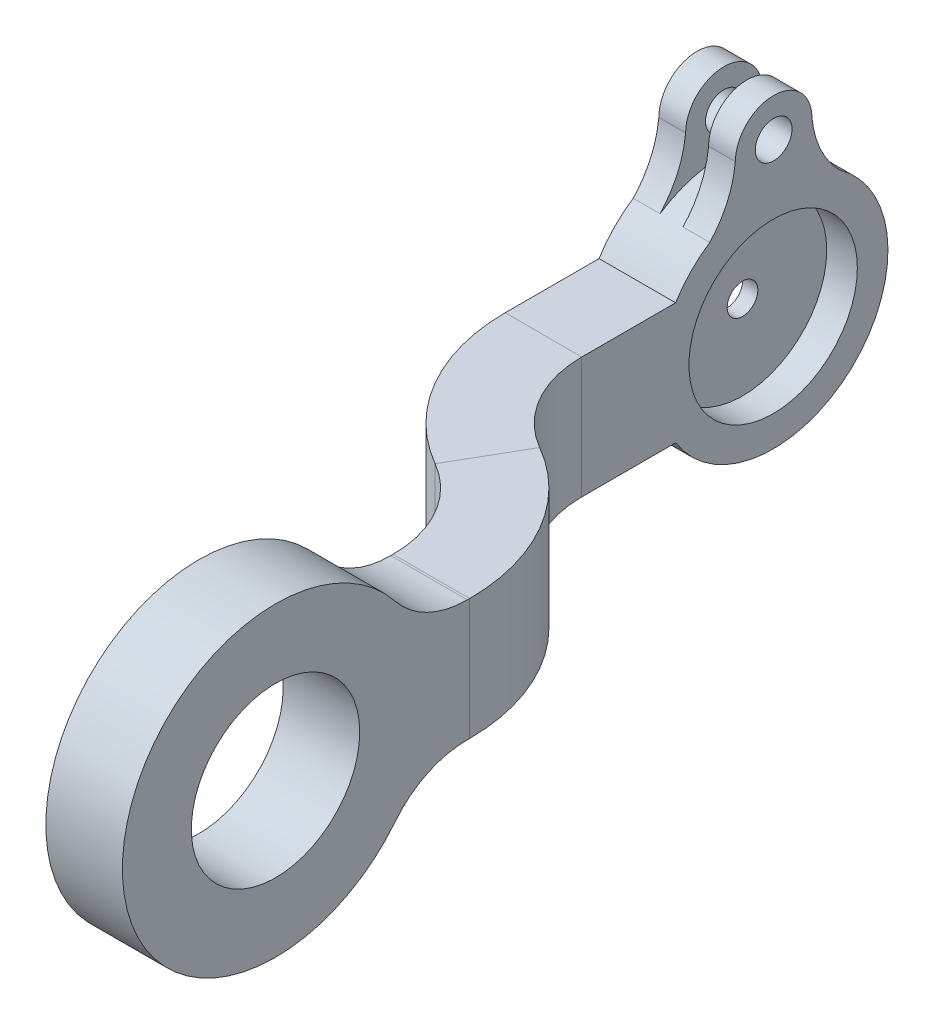
ISO-10303-21;
HEADER;
FILE_DESCRIPTION(('STEP AP214'),'2;1');
FILE_NAME('part.step','',(''),(''),'','','');
FILE_SCHEMA(('AUTOMOTIVE_DESIGN { 1 0 10303 214 1 1 1 1 }'));
ENDSEC;
DATA;
#1=APPLICATION_CONTEXT('core data for automotive mechanical design processes');
#2=APPLICATION_PROTOCOL_DEFINITION('international standard','automotive_design',2000,#1);
#3=PRODUCT_CONTEXT('',#1,'mechanical');
#4=PRODUCT('Part','Part','',(#3));
#5=PRODUCT_RELATED_PRODUCT_CATEGORY('part','',(#4));
#6=PRODUCT_DEFINITION_FORMATION('','',#4);
#7=PRODUCT_DEFINITION_CONTEXT('part definition',#1,'design');
#8=PRODUCT_DEFINITION('design','',#6,#7);
#9=PRODUCT_DEFINITION_SHAPE('','',#8);
#10=(LENGTH_UNIT() NAMED_UNIT(*) SI_UNIT(.MILLI.,.METRE.));
#11=(NAMED_UNIT(*) PLANE_ANGLE_UNIT() SI_UNIT($,.RADIAN.));
#12=(NAMED_UNIT(*) SI_UNIT($,.STERADIAN.) SOLID_ANGLE_UNIT());
#13=UNCERTAINTY_MEASURE_WITH_UNIT(LENGTH_MEASURE(1.E-05),#10,'distance_accuracy_value','');
#14=(GEOMETRIC_REPRESENTATION_CONTEXT(3) GLOBAL_UNCERTAINTY_ASSIGNED_CONTEXT((#13)) GLOBAL_UNIT_ASSIGNED_CONTEXT((#10,
#11,#12)) REPRESENTATION_CONTEXT('',''));
#15=CARTESIAN_POINT('',(0.,0.,0.));
#16=DIRECTION('',(0.,0.,1.));
#17=DIRECTION('',(1.,0.,0.));
#18=AXIS2_PLACEMENT_3D('',#15,#16,#17);
#19=CARTESIAN_POINT('',(-21.,0.,-85.));
#20=DIRECTION('',(1.,0.,0.));
#21=DIRECTION('',(0.,0.,-1.));
#22=AXIS2_PLACEMENT_3D('',#19,#20,#21);
#23=CYLINDRICAL_SURFACE('',#22,2.);
#24=CARTESIAN_POINT('',(-21.,0.,-85.));
#25=DIRECTION('',(1.,0.,0.));
#26=DIRECTION('',(0.,0.,-1.));
#27=AXIS2_PLACEMENT_3D('',#24,#25,#26);
#28=CIRCLE('',#27,2.);
#29=CARTESIAN_POINT('',(-21.,0.,-87.));
#30=VERTEX_POINT('',#29);
#31=EDGE_CURVE('E526',#30,#30,#28,.T.);
#32=ORIENTED_EDGE('',*,*,#31,.F.);
#33=EDGE_LOOP('',(#32));
#34=FACE_BOUND('',#33,.T.);
#35=CARTESIAN_POINT('',(-19.,0.,-85.));
#36=DIRECTION('',(1.,0.,0.));
#37=DIRECTION('',(0.,0.,-1.));
#38=AXIS2_PLACEMENT_3D('',#35,#36,#37);
#39=CIRCLE('',#38,2.);
#40=CARTESIAN_POINT('',(-19.,0.,-87.));
#41=VERTEX_POINT('',#40);
#42=EDGE_CURVE('E45',#41,#41,#39,.F.);
#43=ORIENTED_EDGE('',*,*,#42,.F.);
#44=EDGE_LOOP('',(#43));
#45=FACE_BOUND('',#44,.T.);
#46=ADVANCED_FACE('F41',(#34,#45),#23,.F.);
#47=CARTESIAN_POINT('',(-5.,-19.9174516240623,-25.0458603526239));
#48=DIRECTION('',(1.,0.,0.));
#49=DIRECTION('',(0.,0.,-1.));
#50=AXIS2_PLACEMENT_3D('',#47,#48,#49);
#51=CYLINDRICAL_SURFACE('',#50,12.);
#52=DIRECTION('',(-1.,0.,0.));
#53=VECTOR('',#52,1.);
#54=CARTESIAN_POINT('',(-5.,-7.91745162406235,-25.0458603526239));
#55=LINE('',#54,#53);
#56=CARTESIAN_POINT('',(5.,-7.91745162406235,-25.0458603526239));
#57=VERTEX_POINT('',#56);
#58=CARTESIAN_POINT('',(-5.,-7.91745162406235,-25.0458603526239));
#59=VERTEX_POINT('',#58);
#60=EDGE_CURVE('E457',#57,#59,#55,.T.);
#61=ORIENTED_EDGE('',*,*,#60,.F.);
#62=CARTESIAN_POINT('',(5.,-19.9174516240623,-25.0458603526239));
#63=DIRECTION('',(1.,0.,0.));
#64=DIRECTION('',(0.,0.,-1.));
#65=AXIS2_PLACEMENT_3D('',#62,#63,#64);
#66=CIRCLE('',#65,12.);
#67=CARTESIAN_POINT('',(5.,-12.448407265039,-15.6536627203899));
#68=VERTEX_POINT('',#67);
#69=EDGE_CURVE('E51',#57,#68,#66,.T.);
#70=ORIENTED_EDGE('',*,*,#69,.T.);
#71=DIRECTION('',(1.,0.,0.));
#72=VECTOR('',#71,1.);
#73=CARTESIAN_POINT('',(-5.,-12.448407265039,-15.6536627203899));
#74=LINE('',#73,#72);
#75=CARTESIAN_POINT('',(-5.,-12.448407265039,-15.6536627203899));
#76=VERTEX_POINT('',#75);
#77=EDGE_CURVE('E461',#76,#68,#74,.T.);
#78=ORIENTED_EDGE('',*,*,#77,.F.);
#79=CARTESIAN_POINT('',(-5.,-19.9174516240623,-25.0458603526239));
#80=DIRECTION('',(-1.,0.,0.));
#81=DIRECTION('',(0.,0.,1.));
#82=AXIS2_PLACEMENT_3D('',#79,#80,#81);
#83=CIRCLE('',#82,12.);
#84=EDGE_CURVE('E11',#76,#59,#83,.T.);
#85=ORIENTED_EDGE('',*,*,#84,.T.);
#86=EDGE_LOOP('',(#61,#70,#78,#85));
#87=FACE_BOUND('',#86,.T.);
#88=ADVANCED_FACE('F43',(#87),#51,.F.);
#89=CARTESIAN_POINT('',(-5.,19.9174516240623,-25.0458603526239));
#90=DIRECTION('',(1.,0.,0.));
#91=DIRECTION('',(0.,0.,-1.));
#92=AXIS2_PLACEMENT_3D('',#89,#90,#91);
#93=CYLINDRICAL_SURFACE('',#92,12.);
#94=DIRECTION('',(-1.,0.,0.));
#95=VECTOR('',#94,1.);
#96=CARTESIAN_POINT('',(-5.,7.91745162406235,-25.0458603526239));
#97=LINE('',#96,#95);
#98=CARTESIAN_POINT('',(-5.,7.91745162406235,-25.0458603526239));
#99=VERTEX_POINT('',#98);
#100=CARTESIAN_POINT('',(5.,7.91745162406235,-25.0458603526239));
#101=VERTEX_POINT('',#100);
#102=EDGE_CURVE('E438',#99,#101,#97,.F.);
#103=ORIENTED_EDGE('',*,*,#102,.F.);
#104=CARTESIAN_POINT('',(-5.,19.9174516240623,-25.0458603526239));
#105=DIRECTION('',(-1.,0.,0.));
#106=DIRECTION('',(0.,0.,1.));
#107=AXIS2_PLACEMENT_3D('',#104,#105,#106);
#108=CIRCLE('',#107,12.);
#109=CARTESIAN_POINT('',(-5.,12.448407265039,-15.6536627203899));
#110=VERTEX_POINT('',#109);
#111=EDGE_CURVE('E451',#99,#110,#108,.T.);
#112=ORIENTED_EDGE('',*,*,#111,.T.);
#113=DIRECTION('',(1.,0.,0.));
#114=VECTOR('',#113,1.);
#115=CARTESIAN_POINT('',(-5.,12.448407265039,-15.6536627203899));
#116=LINE('',#115,#114);
#117=CARTESIAN_POINT('',(5.,12.448407265039,-15.6536627203899));
#118=VERTEX_POINT('',#117);
#119=EDGE_CURVE('E447',#118,#110,#116,.F.);
#120=ORIENTED_EDGE('',*,*,#119,.F.);
#121=CARTESIAN_POINT('',(5.,19.9174516240623,-25.0458603526239));
#122=DIRECTION('',(1.,0.,0.));
#123=DIRECTION('',(0.,0.,-1.));
#124=AXIS2_PLACEMENT_3D('',#121,#122,#123);
#125=CIRCLE('',#124,12.);
#126=EDGE_CURVE('E454',#118,#101,#125,.T.);
#127=ORIENTED_EDGE('',*,*,#126,.T.);
#128=EDGE_LOOP('',(#103,#112,#120,#127));
#129=FACE_BOUND('',#128,.T.);
#130=ADVANCED_FACE('F636',(#129),#93,.F.);
#131=CARTESIAN_POINT('',(-25.,0.,-85.));
#132=DIRECTION('',(1.,0.,0.));
#133=DIRECTION('',(0.,0.,-1.));
#134=AXIS2_PLACEMENT_3D('',#131,#132,#133);
#135=CYLINDRICAL_SURFACE('',#134,15.);
#136=CARTESIAN_POINT('',(-21.5,0.,-85.));
#137=DIRECTION('',(-1.,0.,0.));
#138=DIRECTION('',(0.,0.,1.));
#139=AXIS2_PLACEMENT_3D('',#136,#137,#138);
#140=CIRCLE('',#139,15.);
#141=CARTESIAN_POINT('',(-21.5,12.2408850503567,-93.6695290058892));
#142=VERTEX_POINT('',#141);
#143=CARTESIAN_POINT('',(-21.5,12.510308438301,-76.7239995904679));
#144=VERTEX_POINT('',#143);
#145=EDGE_CURVE('E430',#142,#144,#140,.F.);
#146=ORIENTED_EDGE('',*,*,#145,.T.);
#147=DIRECTION('',(-1.,0.,0.));
#148=VECTOR('',#147,1.);
#149=CARTESIAN_POINT('',(-21.5,12.510308438301,-76.7239995904679));
#150=LINE('',#149,#148);
#151=CARTESIAN_POINT('',(-25.,12.510308438301,-76.7239995904679));
#152=VERTEX_POINT('',#151);
#153=EDGE_CURVE('E205',#144,#152,#150,.T.);
#154=ORIENTED_EDGE('',*,*,#153,.T.);
#155=CARTESIAN_POINT('',(-25.,0.,-85.));
#156=DIRECTION('',(1.,0.,0.));
#157=DIRECTION('',(0.,0.,-1.));
#158=AXIS2_PLACEMENT_3D('',#155,#156,#157);
#159=CIRCLE('',#158,15.);
#160=CARTESIAN_POINT('',(-25.,7.91745162406235,-72.2597504035191));
#161=VERTEX_POINT('',#160);
#162=EDGE_CURVE('E300',#152,#161,#159,.T.);
#163=ORIENTED_EDGE('',*,*,#162,.T.);
#164=DIRECTION('',(1.,0.,0.));
#165=VECTOR('',#164,1.);
#166=CARTESIAN_POINT('',(-25.,7.91745162406235,-72.2597504035191));
#167=LINE('',#166,#165);
#168=CARTESIAN_POINT('',(-15.,7.91745162406235,-72.2597504035191));
#169=VERTEX_POINT('',#168);
#170=EDGE_CURVE('E299',#161,#169,#167,.T.);
#171=ORIENTED_EDGE('',*,*,#170,.T.);
#172=CARTESIAN_POINT('',(-15.,0.,-85.));
#173=DIRECTION('',(1.,0.,0.));
#174=DIRECTION('',(0.,0.,-1.));
#175=AXIS2_PLACEMENT_3D('',#172,#173,#174);
#176=CIRCLE('',#175,15.);
#177=CARTESIAN_POINT('',(-15.,12.510308438301,-76.7239995904679));
#178=VERTEX_POINT('',#177);
#179=EDGE_CURVE('E292',#178,#169,#176,.T.);
#180=ORIENTED_EDGE('',*,*,#179,.F.);
#181=DIRECTION('',(1.,0.,0.));
#182=VECTOR('',#181,1.);
#183=CARTESIAN_POINT('',(-18.5,12.510308438301,-76.7239995904679));
#184=LINE('',#183,#182);
#185=CARTESIAN_POINT('',(-18.5,12.510308438301,-76.7239995904679));
#186=VERTEX_POINT('',#185);
#187=EDGE_CURVE('E426',#186,#178,#184,.T.);
#188=ORIENTED_EDGE('',*,*,#187,.F.);
#189=CARTESIAN_POINT('',(-18.5,0.,-85.));
#190=DIRECTION('',(1.,0.,0.));
#191=DIRECTION('',(0.,0.,-1.));
#192=AXIS2_PLACEMENT_3D('',#189,#190,#191);
#193=CIRCLE('',#192,15.);
#194=CARTESIAN_POINT('',(-18.5,12.2408850503567,-93.6695290058892));
#195=VERTEX_POINT('',#194);
#196=EDGE_CURVE('E419',#186,#195,#193,.F.);
#197=ORIENTED_EDGE('',*,*,#196,.T.);
#198=DIRECTION('',(1.,0.,0.));
#199=VECTOR('',#198,1.);
#200=CARTESIAN_POINT('',(-18.5,12.2408850503567,-93.6695290058892));
#201=LINE('',#200,#199);
#202=CARTESIAN_POINT('',(-15.,12.2408850503567,-93.6695290058892));
#203=VERTEX_POINT('',#202);
#204=EDGE_CURVE('E423',#203,#195,#201,.F.);
#205=ORIENTED_EDGE('',*,*,#204,.F.);
#206=CARTESIAN_POINT('',(-15.,-7.91745162406235,-72.2597504035191));
#207=VERTEX_POINT('',#206);
#208=EDGE_CURVE('E301',#207,#203,#176,.T.);
#209=ORIENTED_EDGE('',*,*,#208,.F.);
#210=DIRECTION('',(1.,0.,0.));
#211=VECTOR('',#210,1.);
#212=CARTESIAN_POINT('',(-25.,-7.91745162406235,-72.2597504035191));
#213=LINE('',#212,#211);
#214=CARTESIAN_POINT('',(-25.,-7.91745162406235,-72.2597504035191));
#215=VERTEX_POINT('',#214);
#216=EDGE_CURVE('E406',#207,#215,#213,.F.);
#217=ORIENTED_EDGE('',*,*,#216,.T.);
#218=CARTESIAN_POINT('',(-25.,12.2408850503567,-93.6695290058892));
#219=VERTEX_POINT('',#218);
#220=EDGE_CURVE('E296',#215,#219,#159,.T.);
#221=ORIENTED_EDGE('',*,*,#220,.T.);
#222=DIRECTION('',(-1.,0.,0.));
#223=VECTOR('',#222,1.);
#224=CARTESIAN_POINT('',(-21.5,12.2408850503567,-93.6695290058892));
#225=LINE('',#224,#223);
#226=EDGE_CURVE('E433',#219,#142,#225,.F.);
#227=ORIENTED_EDGE('',*,*,#226,.T.);
#228=EDGE_LOOP('',(#146,#154,#163,#171,#180,#188,#197,#205,#209,#217,#221,#227));
#229=FACE_BOUND('',#228,.T.);
#230=ADVANCED_FACE('F565',(#229),#135,.T.);
#231=CARTESIAN_POINT('',(-15.,-7.91745162406235,-85.));
#232=DIRECTION('',(1.,0.,0.));
#233=DIRECTION('',(0.,0.,-1.));
#234=AXIS2_PLACEMENT_3D('',#231,#232,#233);
#235=PLANE('',#234);
#236=CARTESIAN_POINT('',(-15.,0.,-85.));
#237=DIRECTION('',(1.,0.,0.));
#238=DIRECTION('',(0.,0.,-1.));
#239=AXIS2_PLACEMENT_3D('',#236,#237,#238);
#240=CIRCLE('',#239,11.);
#241=CARTESIAN_POINT('',(-15.,0.,-96.));
#242=VERTEX_POINT('',#241);
#243=EDGE_CURVE('E532',#242,#242,#240,.T.);
#244=ORIENTED_EDGE('',*,*,#243,.F.);
#245=EDGE_LOOP('',(#244));
#246=FACE_BOUND('',#245,.T.);
#247=CARTESIAN_POINT('',(-15.,19.972615480825,-85.0684964390711));
#248=DIRECTION('',(1.,0.,0.));
#249=DIRECTION('',(0.,0.,-1.));
#250=AXIS2_PLACEMENT_3D('',#247,#248,#249);
#251=CIRCLE('',#250,2.4);
#252=CARTESIAN_POINT('',(-15.,19.972615480825,-87.468496439071));
#253=VERTEX_POINT('',#252);
#254=EDGE_CURVE('E550',#253,#253,#251,.T.);
#255=ORIENTED_EDGE('',*,*,#254,.F.);
#256=EDGE_LOOP('',(#255));
#257=FACE_BOUND('',#256,.T.);
#258=ORIENTED_EDGE('',*,*,#208,.T.);
#259=CARTESIAN_POINT('',(-15.,11.6439228128336,-94.2885274391543));
#260=CARTESIAN_POINT('',(-15.,15.0282523884813,-90.5702618472204));
#261=CARTESIAN_POINT('',(-15.,19.972615480825,-90.0684964390711));
#262=B_SPLINE_CURVE_WITH_KNOTS('',2,(#259,#260,#261),.UNSPECIFIED.,.F.,.F.,(3,3),(0.,1.),.UNSPECIFIED.);
#263=CARTESIAN_POINT('',(-15.,19.972615480825,-90.068496439071));
#264=VERTEX_POINT('',#263);
#265=EDGE_CURVE('E266',#203,#264,#262,.T.);
#266=ORIENTED_EDGE('',*,*,#265,.T.);
#267=CARTESIAN_POINT('',(-15.,19.972615480825,-85.0684964390711));
#268=DIRECTION('',(1.,0.,0.));
#269=DIRECTION('',(0.,0.,-1.));
#270=AXIS2_PLACEMENT_3D('',#267,#268,#269);
#271=CIRCLE('',#270,4.99999999999999);
#272=CARTESIAN_POINT('',(-15.,19.972615480825,-80.0684964390711));
#273=VERTEX_POINT('',#272);
#274=EDGE_CURVE('E274',#264,#273,#271,.T.);
#275=ORIENTED_EDGE('',*,*,#274,.T.);
#276=CARTESIAN_POINT('',(-15.,19.972615480825,-80.068496439071));
#277=CARTESIAN_POINT('',(-15.,15.0282523884813,-79.5667310309217));
#278=CARTESIAN_POINT('',(-15.,11.6439228128336,-75.8484654389878));
#279=B_SPLINE_CURVE_WITH_KNOTS('',2,(#276,#277,#278),.UNSPECIFIED.,.F.,.F.,(3,3),(0.,1.),.UNSPECIFIED.);
#280=EDGE_CURVE('E261',#273,#178,#279,.T.);
#281=ORIENTED_EDGE('',*,*,#280,.T.);
#282=ORIENTED_EDGE('',*,*,#179,.T.);
#283=DIRECTION('',(0.,0.,1.));
#284=VECTOR('',#283,1.);
#285=CARTESIAN_POINT('',(-15.,7.91745162406235,-85.));
#286=LINE('',#285,#284);
#287=CARTESIAN_POINT('',(-15.,7.91745162406235,-60.));
#288=VERTEX_POINT('',#287);
#289=EDGE_CURVE('E313',#169,#288,#286,.T.);
#290=ORIENTED_EDGE('',*,*,#289,.T.);
#291=DIRECTION('',(0.,1.,0.));
#292=VECTOR('',#291,1.);
#293=CARTESIAN_POINT('',(-15.,-7.91745162406235,-60.));
#294=LINE('',#293,#292);
#295=CARTESIAN_POINT('',(-15.,-7.91745162406235,-60.));
#296=VERTEX_POINT('',#295);
#297=EDGE_CURVE('E309',#296,#288,#294,.T.);
#298=ORIENTED_EDGE('',*,*,#297,.F.);
#299=DIRECTION('',(0.,0.,1.));
#300=VECTOR('',#299,1.);
#301=CARTESIAN_POINT('',(-15.,-7.91745162406235,-85.));
#302=LINE('',#301,#300);
#303=EDGE_CURVE('E308',#207,#296,#302,.T.);
#304=ORIENTED_EDGE('',*,*,#303,.F.);
#305=EDGE_LOOP('',(#258,#266,#275,#281,#282,#290,#298,#304));
#306=FACE_BOUND('',#305,.T.);
#307=ADVANCED_FACE('F561',(#246,#257,#306),#235,.T.);
#308=CARTESIAN_POINT('',(-15.,7.91745162406235,-85.));
#309=DIRECTION('',(0.,1.,0.));
#310=DIRECTION('',(0.,0.,1.));
#311=AXIS2_PLACEMENT_3D('',#308,#309,#310);
#312=PLANE('',#311);
#313=ORIENTED_EDGE('',*,*,#170,.F.);
#314=DIRECTION('',(0.,0.,1.));
#315=VECTOR('',#314,1.);
#316=CARTESIAN_POINT('',(-25.,7.91745162406235,-85.));
#317=LINE('',#316,#315);
#318=CARTESIAN_POINT('',(-25.,7.91745162406235,-60.));
#319=VERTEX_POINT('',#318);
#320=EDGE_CURVE('E360',#161,#319,#317,.T.);
#321=ORIENTED_EDGE('',*,*,#320,.T.);
#322=DIRECTION('',(-1.,0.,0.));
#323=VECTOR('',#322,1.);
#324=CARTESIAN_POINT('',(-15.,7.91745162406235,-60.));
#325=LINE('',#324,#323);
#326=EDGE_CURVE('E316',#288,#319,#325,.T.);
#327=ORIENTED_EDGE('',*,*,#326,.F.);
#328=ORIENTED_EDGE('',*,*,#289,.F.);
#329=EDGE_LOOP('',(#313,#321,#327,#328));
#330=FACE_BOUND('',#329,.T.);
#331=ADVANCED_FACE('F564',(#330),#312,.T.);
#332=CARTESIAN_POINT('',(-25.,-7.91745162406235,-85.));
#333=DIRECTION('',(-1.,0.,0.));
#334=DIRECTION('',(0.,0.,1.));
#335=AXIS2_PLACEMENT_3D('',#332,#333,#334);
#336=PLANE('',#335);
#337=CARTESIAN_POINT('',(-25.,0.,-85.));
#338=DIRECTION('',(-1.,0.,0.));
#339=DIRECTION('',(0.,0.,1.));
#340=AXIS2_PLACEMENT_3D('',#337,#338,#339);
#341=CIRCLE('',#340,11.);
#342=CARTESIAN_POINT('',(-25.,0.,-74.));
#343=VERTEX_POINT('',#342);
#344=EDGE_CURVE('E530',#343,#343,#341,.T.);
#345=ORIENTED_EDGE('',*,*,#344,.F.);
#346=EDGE_LOOP('',(#345));
#347=FACE_BOUND('',#346,.T.);
#348=CARTESIAN_POINT('',(-25.,19.972615480825,-85.0684964390711));
#349=DIRECTION('',(1.,0.,0.));
#350=DIRECTION('',(0.,0.,-1.));
#351=AXIS2_PLACEMENT_3D('',#348,#349,#350);
#352=CIRCLE('',#351,2.4);
#353=CARTESIAN_POINT('',(-25.,19.972615480825,-87.468496439071));
#354=VERTEX_POINT('',#353);
#355=EDGE_CURVE('E443',#354,#354,#352,.T.);
#356=ORIENTED_EDGE('',*,*,#355,.T.);
#357=EDGE_LOOP('',(#356));
#358=FACE_BOUND('',#357,.T.);
#359=ORIENTED_EDGE('',*,*,#162,.F.);
#360=CARTESIAN_POINT('',(-25.,19.972615480825,-80.068496439071));
#361=CARTESIAN_POINT('',(-25.,15.0282523884813,-79.5667310309217));
#362=CARTESIAN_POINT('',(-25.,11.6439228128336,-75.8484654389878));
#363=B_SPLINE_CURVE_WITH_KNOTS('',2,(#360,#361,#362),.UNSPECIFIED.,.F.,.F.,(3,3),(0.,1.),.UNSPECIFIED.);
#364=CARTESIAN_POINT('',(-25.,19.972615480825,-80.0684964390711));
#365=VERTEX_POINT('',#364);
#366=EDGE_CURVE('E476',#365,#152,#363,.T.);
#367=ORIENTED_EDGE('',*,*,#366,.F.);
#368=CARTESIAN_POINT('',(-25.,19.972615480825,-85.0684964390711));
#369=DIRECTION('',(1.,0.,0.));
#370=DIRECTION('',(0.,0.,-1.));
#371=AXIS2_PLACEMENT_3D('',#368,#369,#370);
#372=CIRCLE('',#371,4.99999999999999);
#373=CARTESIAN_POINT('',(-25.,19.972615480825,-90.068496439071));
#374=VERTEX_POINT('',#373);
#375=EDGE_CURVE('E195',#374,#365,#372,.T.);
#376=ORIENTED_EDGE('',*,*,#375,.F.);
#377=CARTESIAN_POINT('',(-25.,11.6439228128336,-94.2885274391543));
#378=CARTESIAN_POINT('',(-25.,15.0282523884813,-90.5702618472204));
#379=CARTESIAN_POINT('',(-25.,19.972615480825,-90.0684964390711));
#380=B_SPLINE_CURVE_WITH_KNOTS('',2,(#377,#378,#379),.UNSPECIFIED.,.F.,.F.,(3,3),(0.,1.),.UNSPECIFIED.);
#381=EDGE_CURVE('E207',#219,#374,#380,.T.);
#382=ORIENTED_EDGE('',*,*,#381,.F.);
#383=ORIENTED_EDGE('',*,*,#220,.F.);
#384=DIRECTION('',(0.,0.,1.));
#385=VECTOR('',#384,1.);
#386=CARTESIAN_POINT('',(-25.,-7.91745162406235,-85.));
#387=LINE('',#386,#385);
#388=CARTESIAN_POINT('',(-25.,-7.91745162406235,-60.));
#389=VERTEX_POINT('',#388);
#390=EDGE_CURVE('E387',#215,#389,#387,.T.);
#391=ORIENTED_EDGE('',*,*,#390,.T.);
#392=DIRECTION('',(0.,-1.,0.));
#393=VECTOR('',#392,1.);
#394=CARTESIAN_POINT('',(-25.,-7.91745162406235,-60.));
#395=LINE('',#394,#393);
#396=EDGE_CURVE('E363',#319,#389,#395,.T.);
#397=ORIENTED_EDGE('',*,*,#396,.F.);
#398=ORIENTED_EDGE('',*,*,#320,.F.);
#399=EDGE_LOOP('',(#359,#367,#376,#382,#383,#391,#397,#398));
#400=FACE_BOUND('',#399,.T.);
#401=ADVANCED_FACE('F593',(#347,#358,#400),#336,.T.);
#402=CARTESIAN_POINT('',(-15.,-7.91745162406235,-85.));
#403=DIRECTION('',(0.,-1.,0.));
#404=DIRECTION('',(0.,0.,-1.));
#405=AXIS2_PLACEMENT_3D('',#402,#403,#404);
#406=PLANE('',#405);
#407=ORIENTED_EDGE('',*,*,#216,.F.);
#408=ORIENTED_EDGE('',*,*,#303,.T.);
#409=DIRECTION('',(1.,0.,0.));
#410=VECTOR('',#409,1.);
#411=CARTESIAN_POINT('',(-15.,-7.91745162406235,-60.));
#412=LINE('',#411,#410);
#413=EDGE_CURVE('E332',#389,#296,#412,.T.);
#414=ORIENTED_EDGE('',*,*,#413,.F.);
#415=ORIENTED_EDGE('',*,*,#390,.F.);
#416=EDGE_LOOP('',(#407,#408,#414,#415));
#417=FACE_BOUND('',#416,.T.);
#418=ADVANCED_FACE('F609',(#417),#406,.T.);
#419=CARTESIAN_POINT('',(0.,0.,-60.));
#420=DIRECTION('',(0.,1.,0.));
#421=DIRECTION('',(0.,0.,1.));
#422=AXIS2_PLACEMENT_3D('',#419,#420,#421);
#423=CYLINDRICAL_SURFACE('',#422,15.);
#424=CARTESIAN_POINT('',(0.,7.91745162406235,-60.));
#425=DIRECTION('',(0.,1.,0.));
#426=DIRECTION('',(-1.,0.,0.));
#427=AXIS2_PLACEMENT_3D('',#424,#425,#426);
#428=CIRCLE('',#427,15.);
#429=CARTESIAN_POINT('',(-7.50000000000001,7.91745162406235,-47.0096189432334));
#430=VERTEX_POINT('',#429);
#431=EDGE_CURVE('E323',#288,#430,#428,.T.);
#432=ORIENTED_EDGE('',*,*,#431,.T.);
#433=DIRECTION('',(0.,1.,0.));
#434=VECTOR('',#433,1.);
#435=CARTESIAN_POINT('',(-7.50000000000001,-7.91745162406235,-47.0096189432334));
#436=LINE('',#435,#434);
#437=CARTESIAN_POINT('',(-7.50000000000001,-7.91745162406235,-47.0096189432334));
#438=VERTEX_POINT('',#437);
#439=EDGE_CURVE('E319',#438,#430,#436,.T.);
#440=ORIENTED_EDGE('',*,*,#439,.F.);
#441=CARTESIAN_POINT('',(0.,-7.91745162406235,-60.));
#442=DIRECTION('',(0.,1.,0.));
#443=DIRECTION('',(-1.,0.,0.));
#444=AXIS2_PLACEMENT_3D('',#441,#442,#443);
#445=CIRCLE('',#444,15.);
#446=EDGE_CURVE('E324',#296,#438,#445,.T.);
#447=ORIENTED_EDGE('',*,*,#446,.F.);
#448=ORIENTED_EDGE('',*,*,#297,.T.);
#449=EDGE_LOOP('',(#432,#440,#447,#448));
#450=FACE_BOUND('',#449,.T.);
#451=ADVANCED_FACE('F602',(#450),#423,.F.);
#452=CARTESIAN_POINT('',(-15.,7.91745162406235,-60.));
#453=DIRECTION('',(0.,1.,0.));
#454=DIRECTION('',(0.,0.,1.));
#455=AXIS2_PLACEMENT_3D('',#452,#453,#454);
#456=PLANE('',#455);
#457=CARTESIAN_POINT('',(0.,7.91745162406235,-60.));
#458=DIRECTION('',(0.,1.,0.));
#459=DIRECTION('',(-1.,0.,0.));
#460=AXIS2_PLACEMENT_3D('',#457,#458,#459);
#461=CIRCLE('',#460,25.);
#462=CARTESIAN_POINT('',(-12.5,7.91745162406235,-38.349364905389));
#463=VERTEX_POINT('',#462);
#464=EDGE_CURVE('E367',#319,#463,#461,.T.);
#465=ORIENTED_EDGE('',*,*,#464,.T.);
#466=DIRECTION('',(-0.5,0.,0.866025403784438));
#467=VECTOR('',#466,1.);
#468=CARTESIAN_POINT('',(-7.50000000000001,7.91745162406235,-47.0096189432334));
#469=LINE('',#468,#467);
#470=EDGE_CURVE('E328',#430,#463,#469,.T.);
#471=ORIENTED_EDGE('',*,*,#470,.F.);
#472=ORIENTED_EDGE('',*,*,#431,.F.);
#473=ORIENTED_EDGE('',*,*,#326,.T.);
#474=EDGE_LOOP('',(#465,#471,#472,#473));
#475=FACE_BOUND('',#474,.T.);
#476=ADVANCED_FACE('F598',(#475),#456,.T.);
#477=CARTESIAN_POINT('',(0.,0.,-60.));
#478=DIRECTION('',(0.,1.,0.));
#479=DIRECTION('',(0.,0.,1.));
#480=AXIS2_PLACEMENT_3D('',#477,#478,#479);
#481=CYLINDRICAL_SURFACE('',#480,25.);
#482=CARTESIAN_POINT('',(0.,-7.91745162406235,-60.));
#483=DIRECTION('',(0.,1.,0.));
#484=DIRECTION('',(-1.,0.,0.));
#485=AXIS2_PLACEMENT_3D('',#482,#483,#484);
#486=CIRCLE('',#485,25.);
#487=CARTESIAN_POINT('',(-12.5,-7.91745162406235,-38.349364905389));
#488=VERTEX_POINT('',#487);
#489=EDGE_CURVE('E393',#389,#488,#486,.T.);
#490=ORIENTED_EDGE('',*,*,#489,.T.);
#491=DIRECTION('',(0.,-1.,0.));
#492=VECTOR('',#491,1.);
#493=CARTESIAN_POINT('',(-12.5,-7.91745162406235,-38.349364905389));
#494=LINE('',#493,#492);
#495=EDGE_CURVE('E371',#463,#488,#494,.T.);
#496=ORIENTED_EDGE('',*,*,#495,.F.);
#497=ORIENTED_EDGE('',*,*,#464,.F.);
#498=ORIENTED_EDGE('',*,*,#396,.T.);
#499=EDGE_LOOP('',(#490,#496,#497,#498));
#500=FACE_BOUND('',#499,.T.);
#501=ADVANCED_FACE('F626',(#500),#481,.T.);
#502=CARTESIAN_POINT('',(-15.,-7.91745162406235,-60.));
#503=DIRECTION('',(0.,-1.,0.));
#504=DIRECTION('',(0.,0.,-1.));
#505=AXIS2_PLACEMENT_3D('',#502,#503,#504);
#506=PLANE('',#505);
#507=DIRECTION('',(0.5,0.,-0.866025403784438));
#508=VECTOR('',#507,1.);
#509=CARTESIAN_POINT('',(-7.50000000000001,-7.91745162406235,-47.0096189432334));
#510=LINE('',#509,#508);
#511=EDGE_CURVE('E346',#488,#438,#510,.T.);
#512=ORIENTED_EDGE('',*,*,#511,.F.);
#513=ORIENTED_EDGE('',*,*,#489,.F.);
#514=ORIENTED_EDGE('',*,*,#413,.T.);
#515=ORIENTED_EDGE('',*,*,#446,.T.);
#516=EDGE_LOOP('',(#512,#513,#514,#515));
#517=FACE_BOUND('',#516,.T.);
#518=ADVANCED_FACE('F607',(#517),#506,.T.);
#519=CARTESIAN_POINT('',(-20.,0.,-25.3589838486225));
#520=DIRECTION('',(0.,-1.,0.));
#521=DIRECTION('',(0.,0.,-1.));
#522=AXIS2_PLACEMENT_3D('',#519,#520,#521);
#523=CYLINDRICAL_SURFACE('',#522,25.);
#524=CARTESIAN_POINT('',(-20.,7.91745162406235,-25.3589838486225));
#525=DIRECTION('',(0.,-1.,0.));
#526=DIRECTION('',(0.5,0.,-0.866025403784439));
#527=AXIS2_PLACEMENT_3D('',#524,#525,#526);
#528=CIRCLE('',#527,25.);
#529=CARTESIAN_POINT('',(4.99999999999999,7.91745162406235,-25.3589838486225));
#530=VERTEX_POINT('',#529);
#531=EDGE_CURVE('E337',#430,#530,#528,.T.);
#532=ORIENTED_EDGE('',*,*,#531,.T.);
#533=DIRECTION('',(0.,1.,0.));
#534=VECTOR('',#533,1.);
#535=CARTESIAN_POINT('',(5.,-7.91745162406235,-25.3589838486225));
#536=LINE('',#535,#534);
#537=CARTESIAN_POINT('',(4.99999999999999,-7.91745162406235,-25.3589838486225));
#538=VERTEX_POINT('',#537);
#539=EDGE_CURVE('E333',#538,#530,#536,.T.);
#540=ORIENTED_EDGE('',*,*,#539,.F.);
#541=CARTESIAN_POINT('',(-20.,-7.91745162406235,-25.3589838486225));
#542=DIRECTION('',(0.,-1.,0.));
#543=DIRECTION('',(0.5,0.,-0.866025403784439));
#544=AXIS2_PLACEMENT_3D('',#541,#542,#543);
#545=CIRCLE('',#544,25.);
#546=EDGE_CURVE('E338',#438,#538,#545,.T.);
#547=ORIENTED_EDGE('',*,*,#546,.F.);
#548=ORIENTED_EDGE('',*,*,#439,.T.);
#549=EDGE_LOOP('',(#532,#540,#547,#548));
#550=FACE_BOUND('',#549,.T.);
#551=ADVANCED_FACE('F625',(#550),#523,.T.);
#552=CARTESIAN_POINT('',(-7.50000000000001,7.91745162406235,-47.0096189432334));
#553=DIRECTION('',(0.,1.,0.));
#554=DIRECTION('',(0.,0.,1.));
#555=AXIS2_PLACEMENT_3D('',#552,#553,#554);
#556=PLANE('',#555);
#557=CARTESIAN_POINT('',(-20.,7.91745162406235,-25.3589838486225));
#558=DIRECTION('',(0.,-1.,0.));
#559=DIRECTION('',(0.5,0.,-0.866025403784439));
#560=AXIS2_PLACEMENT_3D('',#557,#558,#559);
#561=CIRCLE('',#560,15.);
#562=CARTESIAN_POINT('',(-5.,7.91745162406235,-25.3589838486225));
#563=VERTEX_POINT('',#562);
#564=EDGE_CURVE('E375',#463,#563,#561,.T.);
#565=ORIENTED_EDGE('',*,*,#564,.T.);
#566=DIRECTION('',(-1.,0.,0.));
#567=VECTOR('',#566,1.);
#568=CARTESIAN_POINT('',(5.,7.91745162406235,-25.3589838486225));
#569=LINE('',#568,#567);
#570=EDGE_CURVE('E342',#530,#563,#569,.T.);
#571=ORIENTED_EDGE('',*,*,#570,.F.);
#572=ORIENTED_EDGE('',*,*,#531,.F.);
#573=ORIENTED_EDGE('',*,*,#470,.T.);
#574=EDGE_LOOP('',(#565,#571,#572,#573));
#575=FACE_BOUND('',#574,.T.);
#576=ADVANCED_FACE('F653',(#575),#556,.T.);
#577=CARTESIAN_POINT('',(-20.,0.,-25.3589838486225));
#578=DIRECTION('',(0.,-1.,0.));
#579=DIRECTION('',(0.,0.,-1.));
#580=AXIS2_PLACEMENT_3D('',#577,#578,#579);
#581=CYLINDRICAL_SURFACE('',#580,15.);
#582=CARTESIAN_POINT('',(-20.,-7.91745162406235,-25.3589838486225));
#583=DIRECTION('',(0.,-1.,0.));
#584=DIRECTION('',(0.5,0.,-0.866025403784439));
#585=AXIS2_PLACEMENT_3D('',#582,#583,#584);
#586=CIRCLE('',#585,15.);
#587=CARTESIAN_POINT('',(-5.,-7.91745162406235,-25.3589838486225));
#588=VERTEX_POINT('',#587);
#589=EDGE_CURVE('E400',#488,#588,#586,.T.);
#590=ORIENTED_EDGE('',*,*,#589,.T.);
#591=DIRECTION('',(0.,-1.,0.));
#592=VECTOR('',#591,1.);
#593=CARTESIAN_POINT('',(-5.,-7.91745162406235,-25.3589838486225));
#594=LINE('',#593,#592);
#595=EDGE_CURVE('E379',#563,#588,#594,.T.);
#596=ORIENTED_EDGE('',*,*,#595,.F.);
#597=ORIENTED_EDGE('',*,*,#564,.F.);
#598=ORIENTED_EDGE('',*,*,#495,.T.);
#599=EDGE_LOOP('',(#590,#596,#597,#598));
#600=FACE_BOUND('',#599,.T.);
#601=ADVANCED_FACE('F631',(#600),#581,.F.);
#602=CARTESIAN_POINT('',(-7.50000000000001,-7.91745162406235,-47.0096189432334));
#603=DIRECTION('',(0.,-1.,0.));
#604=DIRECTION('',(0.,0.,-1.));
#605=AXIS2_PLACEMENT_3D('',#602,#603,#604);
#606=PLANE('',#605);
#607=DIRECTION('',(1.,0.,0.));
#608=VECTOR('',#607,1.);
#609=CARTESIAN_POINT('',(5.,-7.91745162406235,-25.3589838486225));
#610=LINE('',#609,#608);
#611=EDGE_CURVE('E356',#588,#538,#610,.T.);
#612=ORIENTED_EDGE('',*,*,#611,.F.);
#613=ORIENTED_EDGE('',*,*,#589,.F.);
#614=ORIENTED_EDGE('',*,*,#511,.T.);
#615=ORIENTED_EDGE('',*,*,#546,.T.);
#616=EDGE_LOOP('',(#612,#613,#614,#615));
#617=FACE_BOUND('',#616,.T.);
#618=ADVANCED_FACE('F627',(#617),#606,.T.);
#619=CARTESIAN_POINT('',(5.,-7.91745162406235,-25.3589838486225));
#620=DIRECTION('',(1.,0.,0.));
#621=DIRECTION('',(0.,0.,-1.));
#622=AXIS2_PLACEMENT_3D('',#619,#620,#621);
#623=PLANE('',#622);
#624=ORIENTED_EDGE('',*,*,#126,.F.);
#625=CARTESIAN_POINT('',(5.,0.,0.));
#626=DIRECTION('',(1.,0.,0.));
#627=DIRECTION('',(0.,0.,-1.));
#628=AXIS2_PLACEMENT_3D('',#625,#626,#627);
#629=CIRCLE('',#628,20.);
#630=EDGE_CURVE('E284',#118,#68,#629,.T.);
#631=ORIENTED_EDGE('',*,*,#630,.T.);
#632=ORIENTED_EDGE('',*,*,#69,.F.);
#633=DIRECTION('',(0.,0.,1.));
#634=VECTOR('',#633,1.);
#635=CARTESIAN_POINT('',(5.,-7.91745162406235,-25.3589838486225));
#636=LINE('',#635,#634);
#637=EDGE_CURVE('E352',#538,#57,#636,.T.);
#638=ORIENTED_EDGE('',*,*,#637,.F.);
#639=ORIENTED_EDGE('',*,*,#539,.T.);
#640=DIRECTION('',(0.,0.,1.));
#641=VECTOR('',#640,1.);
#642=CARTESIAN_POINT('',(5.,7.91745162406235,-25.3589838486225));
#643=LINE('',#642,#641);
#644=EDGE_CURVE('E347',#530,#101,#643,.T.);
#645=ORIENTED_EDGE('',*,*,#644,.T.);
#646=EDGE_LOOP('',(#624,#631,#632,#638,#639,#645));
#647=FACE_BOUND('',#646,.T.);
#648=CARTESIAN_POINT('',(5.,0.,0.));
#649=DIRECTION('',(1.,0.,0.));
#650=DIRECTION('',(0.,0.,-1.));
#651=AXIS2_PLACEMENT_3D('',#648,#649,#650);
#652=CIRCLE('',#651,11.);
#653=CARTESIAN_POINT('',(5.,0.,-11.));
#654=VERTEX_POINT('',#653);
#655=EDGE_CURVE('E542',#654,#654,#652,.T.);
#656=ORIENTED_EDGE('',*,*,#655,.F.);
#657=EDGE_LOOP('',(#656));
#658=FACE_BOUND('',#657,.T.);
#659=ADVANCED_FACE('F630',(#647,#658),#623,.T.);
#660=CARTESIAN_POINT('',(5.,7.91745162406235,-25.3589838486225));
#661=DIRECTION('',(0.,1.,0.));
#662=DIRECTION('',(0.,0.,1.));
#663=AXIS2_PLACEMENT_3D('',#660,#661,#662);
#664=PLANE('',#663);
#665=DIRECTION('',(0.,0.,1.));
#666=VECTOR('',#665,1.);
#667=CARTESIAN_POINT('',(-5.,7.91745162406235,-25.3589838486225));
#668=LINE('',#667,#666);
#669=EDGE_CURVE('E351',#563,#99,#668,.T.);
#670=ORIENTED_EDGE('',*,*,#669,.T.);
#671=ORIENTED_EDGE('',*,*,#102,.T.);
#672=ORIENTED_EDGE('',*,*,#644,.F.);
#673=ORIENTED_EDGE('',*,*,#570,.T.);
#674=EDGE_LOOP('',(#670,#671,#672,#673));
#675=FACE_BOUND('',#674,.T.);
#676=ADVANCED_FACE('F647',(#675),#664,.T.);
#677=CARTESIAN_POINT('',(-5.,-7.91745162406235,-25.3589838486225));
#678=DIRECTION('',(-1.,0.,0.));
#679=DIRECTION('',(0.,0.,1.));
#680=AXIS2_PLACEMENT_3D('',#677,#678,#679);
#681=PLANE('',#680);
#682=CARTESIAN_POINT('',(-5.,0.,0.));
#683=DIRECTION('',(1.,0.,0.));
#684=DIRECTION('',(0.,0.,-1.));
#685=AXIS2_PLACEMENT_3D('',#682,#683,#684);
#686=CIRCLE('',#685,11.);
#687=CARTESIAN_POINT('',(-5.,0.,-11.));
#688=VERTEX_POINT('',#687);
#689=EDGE_CURVE('E546',#688,#688,#686,.T.);
#690=ORIENTED_EDGE('',*,*,#689,.T.);
#691=EDGE_LOOP('',(#690));
#692=FACE_BOUND('',#691,.T.);
#693=CARTESIAN_POINT('',(-5.,0.,0.));
#694=DIRECTION('',(1.,0.,0.));
#695=DIRECTION('',(0.,0.,-1.));
#696=AXIS2_PLACEMENT_3D('',#693,#694,#695);
#697=CIRCLE('',#696,20.);
#698=EDGE_CURVE('E288',#110,#76,#697,.T.);
#699=ORIENTED_EDGE('',*,*,#698,.F.);
#700=ORIENTED_EDGE('',*,*,#111,.F.);
#701=ORIENTED_EDGE('',*,*,#669,.F.);
#702=ORIENTED_EDGE('',*,*,#595,.T.);
#703=DIRECTION('',(0.,0.,1.));
#704=VECTOR('',#703,1.);
#705=CARTESIAN_POINT('',(-5.,-7.91745162406235,-25.3589838486225));
#706=LINE('',#705,#704);
#707=EDGE_CURVE('E383',#588,#59,#706,.T.);
#708=ORIENTED_EDGE('',*,*,#707,.T.);
#709=ORIENTED_EDGE('',*,*,#84,.F.);
#710=EDGE_LOOP('',(#699,#700,#701,#702,#708,#709));
#711=FACE_BOUND('',#710,.T.);
#712=ADVANCED_FACE('F621',(#692,#711),#681,.T.);
#713=CARTESIAN_POINT('',(5.,-7.91745162406235,-25.3589838486225));
#714=DIRECTION('',(0.,-1.,0.));
#715=DIRECTION('',(0.,0.,-1.));
#716=AXIS2_PLACEMENT_3D('',#713,#714,#715);
#717=PLANE('',#716);
#718=ORIENTED_EDGE('',*,*,#637,.T.);
#719=ORIENTED_EDGE('',*,*,#60,.T.);
#720=ORIENTED_EDGE('',*,*,#707,.F.);
#721=ORIENTED_EDGE('',*,*,#611,.T.);
#722=EDGE_LOOP('',(#718,#719,#720,#721));
#723=FACE_BOUND('',#722,.T.);
#724=ADVANCED_FACE('F633',(#723),#717,.T.);
#725=CARTESIAN_POINT('',(-5.,0.,0.));
#726=DIRECTION('',(1.,0.,0.));
#727=DIRECTION('',(0.,0.,-1.));
#728=AXIS2_PLACEMENT_3D('',#725,#726,#727);
#729=CYLINDRICAL_SURFACE('',#728,20.);
#730=ORIENTED_EDGE('',*,*,#698,.T.);
#731=ORIENTED_EDGE('',*,*,#77,.T.);
#732=ORIENTED_EDGE('',*,*,#630,.F.);
#733=ORIENTED_EDGE('',*,*,#119,.T.);
#734=EDGE_LOOP('',(#730,#731,#732,#733));
#735=FACE_BOUND('',#734,.T.);
#736=ADVANCED_FACE('F568',(#735),#729,.T.);
#737=CARTESIAN_POINT('',(-18.5,19.972615480825,-80.068496439071));
#738=CARTESIAN_POINT('',(-18.5,15.0282523884813,-79.5667310309217));
#739=CARTESIAN_POINT('',(-18.5,11.6439228128336,-75.8484654389878));
#740=B_SPLINE_CURVE_WITH_KNOTS('',2,(#737,#738,#739),.UNSPECIFIED.,.F.,.F.,(3,3),(0.,1.),.UNSPECIFIED.);
#741=DIRECTION('',(1.,0.,0.));
#742=VECTOR('',#741,1.);
#743=SURFACE_OF_LINEAR_EXTRUSION('',#740,#742);
#744=CARTESIAN_POINT('',(-18.5,19.972615480825,-80.0684964390711));
#745=VERTEX_POINT('',#744);
#746=EDGE_CURVE('E250',#745,#186,#740,.T.);
#747=ORIENTED_EDGE('',*,*,#746,.T.);
#748=ORIENTED_EDGE('',*,*,#187,.T.);
#749=ORIENTED_EDGE('',*,*,#280,.F.);
#750=DIRECTION('',(1.,0.,0.));
#751=VECTOR('',#750,1.);
#752=CARTESIAN_POINT('',(-18.5,19.972615480825,-80.0684964390711));
#753=LINE('',#752,#751);
#754=EDGE_CURVE('E281',#745,#273,#753,.T.);
#755=ORIENTED_EDGE('',*,*,#754,.F.);
#756=EDGE_LOOP('',(#747,#748,#749,#755));
#757=FACE_BOUND('',#756,.T.);
#758=ADVANCED_FACE('F235',(#757),#743,.T.);
#759=CARTESIAN_POINT('',(-18.5,19.972615480825,-85.0684964390711));
#760=DIRECTION('',(1.,0.,0.));
#761=DIRECTION('',(0.,0.,-1.));
#762=AXIS2_PLACEMENT_3D('',#759,#760,#761);
#763=CYLINDRICAL_SURFACE('',#762,4.99999999999999);
#764=ORIENTED_EDGE('',*,*,#274,.F.);
#765=DIRECTION('',(1.,0.,0.));
#766=VECTOR('',#765,1.);
#767=CARTESIAN_POINT('',(-18.5,19.972615480825,-90.068496439071));
#768=LINE('',#767,#766);
#769=CARTESIAN_POINT('',(-18.5,19.972615480825,-90.068496439071));
#770=VERTEX_POINT('',#769);
#771=EDGE_CURVE('E260',#770,#264,#768,.T.);
#772=ORIENTED_EDGE('',*,*,#771,.F.);
#773=CARTESIAN_POINT('',(-18.5,19.972615480825,-85.0684964390711));
#774=DIRECTION('',(1.,0.,0.));
#775=DIRECTION('',(0.,0.,-1.));
#776=AXIS2_PLACEMENT_3D('',#773,#774,#775);
#777=CIRCLE('',#776,4.99999999999999);
#778=EDGE_CURVE('E249',#770,#745,#777,.T.);
#779=ORIENTED_EDGE('',*,*,#778,.T.);
#780=ORIENTED_EDGE('',*,*,#754,.T.);
#781=EDGE_LOOP('',(#764,#772,#779,#780));
#782=FACE_BOUND('',#781,.T.);
#783=ADVANCED_FACE('F232',(#782),#763,.T.);
#784=CARTESIAN_POINT('',(-18.5,11.6439228128336,-94.2885274391543));
#785=CARTESIAN_POINT('',(-18.5,15.0282523884813,-90.5702618472204));
#786=CARTESIAN_POINT('',(-18.5,19.972615480825,-90.0684964390711));
#787=B_SPLINE_CURVE_WITH_KNOTS('',2,(#784,#785,#786),.UNSPECIFIED.,.F.,.F.,(3,3),(0.,1.),.UNSPECIFIED.);
#788=DIRECTION('',(1.,0.,0.));
#789=VECTOR('',#788,1.);
#790=SURFACE_OF_LINEAR_EXTRUSION('',#787,#789);
#791=ORIENTED_EDGE('',*,*,#265,.F.);
#792=ORIENTED_EDGE('',*,*,#204,.T.);
#793=EDGE_CURVE('E243',#195,#770,#787,.T.);
#794=ORIENTED_EDGE('',*,*,#793,.T.);
#795=ORIENTED_EDGE('',*,*,#771,.T.);
#796=EDGE_LOOP('',(#791,#792,#794,#795));
#797=FACE_BOUND('',#796,.T.);
#798=ADVANCED_FACE('F230',(#797),#790,.T.);
#799=CARTESIAN_POINT('',(-18.5,15.4182607676553,-78.7626059849756));
#800=DIRECTION('',(1.,0.,0.));
#801=DIRECTION('',(0.,0.,-1.));
#802=AXIS2_PLACEMENT_3D('',#799,#800,#801);
#803=PLANE('',#802);
#804=CARTESIAN_POINT('',(-18.5,19.972615480825,-85.0684964390711));
#805=DIRECTION('',(1.,0.,0.));
#806=DIRECTION('',(0.,0.,-1.));
#807=AXIS2_PLACEMENT_3D('',#804,#805,#806);
#808=CIRCLE('',#807,2.4);
#809=CARTESIAN_POINT('',(-18.5,19.972615480825,-87.468496439071));
#810=VERTEX_POINT('',#809);
#811=EDGE_CURVE('E215',#810,#810,#808,.T.);
#812=ORIENTED_EDGE('',*,*,#811,.T.);
#813=EDGE_LOOP('',(#812));
#814=FACE_BOUND('',#813,.T.);
#815=ORIENTED_EDGE('',*,*,#196,.F.);
#816=ORIENTED_EDGE('',*,*,#746,.F.);
#817=ORIENTED_EDGE('',*,*,#778,.F.);
#818=ORIENTED_EDGE('',*,*,#793,.F.);
#819=EDGE_LOOP('',(#815,#816,#817,#818));
#820=FACE_BOUND('',#819,.T.);
#821=ADVANCED_FACE('F226',(#814,#820),#803,.F.);
#822=CARTESIAN_POINT('',(-21.5,19.972615480825,-80.068496439071));
#823=CARTESIAN_POINT('',(-21.5,15.0282523884813,-79.5667310309217));
#824=CARTESIAN_POINT('',(-21.5,11.6439228128336,-75.8484654389878));
#825=B_SPLINE_CURVE_WITH_KNOTS('',2,(#822,#823,#824),.UNSPECIFIED.,.F.,.F.,(3,3),(0.,1.),.UNSPECIFIED.);
#826=DIRECTION('',(-1.,0.,0.));
#827=VECTOR('',#826,1.);
#828=SURFACE_OF_LINEAR_EXTRUSION('',#825,#827);
#829=ORIENTED_EDGE('',*,*,#153,.F.);
#830=CARTESIAN_POINT('',(-21.5,19.972615480825,-80.0684964390711));
#831=VERTEX_POINT('',#830);
#832=EDGE_CURVE('E183',#831,#144,#825,.T.);
#833=ORIENTED_EDGE('',*,*,#832,.F.);
#834=DIRECTION('',(-1.,0.,0.));
#835=VECTOR('',#834,1.);
#836=CARTESIAN_POINT('',(-21.5,19.972615480825,-80.0684964390711));
#837=LINE('',#836,#835);
#838=EDGE_CURVE('E192',#831,#365,#837,.T.);
#839=ORIENTED_EDGE('',*,*,#838,.T.);
#840=ORIENTED_EDGE('',*,*,#366,.T.);
#841=EDGE_LOOP('',(#829,#833,#839,#840));
#842=FACE_BOUND('',#841,.T.);
#843=ADVANCED_FACE('F203',(#842),#828,.F.);
#844=CARTESIAN_POINT('',(-21.5,11.6439228128336,-94.2885274391543));
#845=CARTESIAN_POINT('',(-21.5,15.0282523884813,-90.5702618472204));
#846=CARTESIAN_POINT('',(-21.5,19.972615480825,-90.0684964390711));
#847=B_SPLINE_CURVE_WITH_KNOTS('',2,(#844,#845,#846),.UNSPECIFIED.,.F.,.F.,(3,3),(0.,1.),.UNSPECIFIED.);
#848=DIRECTION('',(-1.,0.,0.));
#849=VECTOR('',#848,1.);
#850=SURFACE_OF_LINEAR_EXTRUSION('',#847,#849);
#851=ORIENTED_EDGE('',*,*,#226,.F.);
#852=ORIENTED_EDGE('',*,*,#381,.T.);
#853=DIRECTION('',(-1.,0.,0.));
#854=VECTOR('',#853,1.);
#855=CARTESIAN_POINT('',(-21.5,19.972615480825,-90.068496439071));
#856=LINE('',#855,#854);
#857=CARTESIAN_POINT('',(-21.5,19.972615480825,-90.068496439071));
#858=VERTEX_POINT('',#857);
#859=EDGE_CURVE('E200',#858,#374,#856,.T.);
#860=ORIENTED_EDGE('',*,*,#859,.F.);
#861=EDGE_CURVE('E185',#142,#858,#847,.T.);
#862=ORIENTED_EDGE('',*,*,#861,.F.);
#863=EDGE_LOOP('',(#851,#852,#860,#862));
#864=FACE_BOUND('',#863,.T.);
#865=ADVANCED_FACE('F225',(#864),#850,.F.);
#866=CARTESIAN_POINT('',(-21.5,19.972615480825,-85.0684964390711));
#867=DIRECTION('',(-1.,0.,0.));
#868=DIRECTION('',(0.,0.,1.));
#869=AXIS2_PLACEMENT_3D('',#866,#867,#868);
#870=CYLINDRICAL_SURFACE('',#869,4.99999999999999);
#871=ORIENTED_EDGE('',*,*,#375,.T.);
#872=ORIENTED_EDGE('',*,*,#838,.F.);
#873=CARTESIAN_POINT('',(-21.5,19.972615480825,-85.0684964390711));
#874=DIRECTION('',(1.,0.,0.));
#875=DIRECTION('',(0.,0.,-1.));
#876=AXIS2_PLACEMENT_3D('',#873,#874,#875);
#877=CIRCLE('',#876,4.99999999999999);
#878=EDGE_CURVE('E178',#858,#831,#877,.T.);
#879=ORIENTED_EDGE('',*,*,#878,.F.);
#880=ORIENTED_EDGE('',*,*,#859,.T.);
#881=EDGE_LOOP('',(#871,#872,#879,#880));
#882=FACE_BOUND('',#881,.T.);
#883=ADVANCED_FACE('F193',(#882),#870,.T.);
#884=CARTESIAN_POINT('',(-21.5,15.4182607676553,-78.7626059849756));
#885=DIRECTION('',(-1.,0.,0.));
#886=DIRECTION('',(0.,0.,-1.));
#887=AXIS2_PLACEMENT_3D('',#884,#885,#886);
#888=PLANE('',#887);
#889=CARTESIAN_POINT('',(-21.5,19.972615480825,-85.0684964390711));
#890=DIRECTION('',(-1.,0.,0.));
#891=DIRECTION('',(0.,0.,1.));
#892=AXIS2_PLACEMENT_3D('',#889,#890,#891);
#893=CIRCLE('',#892,2.4);
#894=CARTESIAN_POINT('',(-21.5,19.972615480825,-82.668496439071));
#895=VERTEX_POINT('',#894);
#896=EDGE_CURVE('E439',#895,#895,#893,.T.);
#897=ORIENTED_EDGE('',*,*,#896,.T.);
#898=EDGE_LOOP('',(#897));
#899=FACE_BOUND('',#898,.T.);
#900=ORIENTED_EDGE('',*,*,#145,.F.);
#901=ORIENTED_EDGE('',*,*,#861,.T.);
#902=ORIENTED_EDGE('',*,*,#878,.T.);
#903=ORIENTED_EDGE('',*,*,#832,.T.);
#904=EDGE_LOOP('',(#900,#901,#902,#903));
#905=FACE_BOUND('',#904,.T.);
#906=ADVANCED_FACE('F181',(#899,#905),#888,.F.);
#907=CARTESIAN_POINT('',(-25.,19.972615480825,-85.0684964390711));
#908=DIRECTION('',(1.,0.,0.));
#909=DIRECTION('',(0.,0.,-1.));
#910=AXIS2_PLACEMENT_3D('',#907,#908,#909);
#911=CYLINDRICAL_SURFACE('',#910,2.4);
#912=ORIENTED_EDGE('',*,*,#355,.F.);
#913=EDGE_LOOP('',(#912));
#914=FACE_BOUND('',#913,.T.);
#915=ORIENTED_EDGE('',*,*,#896,.F.);
#916=EDGE_LOOP('',(#915));
#917=FACE_BOUND('',#916,.T.);
#918=ADVANCED_FACE('F488',(#914,#917),#911,.F.);
#919=ORIENTED_EDGE('',*,*,#254,.T.);
#920=EDGE_LOOP('',(#919));
#921=FACE_BOUND('',#920,.T.);
#922=ORIENTED_EDGE('',*,*,#811,.F.);
#923=EDGE_LOOP('',(#922));
#924=FACE_BOUND('',#923,.T.);
#925=ADVANCED_FACE('F490',(#921,#924),#911,.F.);
#926=CARTESIAN_POINT('',(-5.,0.,0.));
#927=DIRECTION('',(1.,0.,0.));
#928=DIRECTION('',(0.,0.,-1.));
#929=AXIS2_PLACEMENT_3D('',#926,#927,#928);
#930=CYLINDRICAL_SURFACE('',#929,11.);
#931=ORIENTED_EDGE('',*,*,#689,.F.);
#932=EDGE_LOOP('',(#931));
#933=FACE_BOUND('',#932,.T.);
#934=ORIENTED_EDGE('',*,*,#655,.T.);
#935=EDGE_LOOP('',(#934));
#936=FACE_BOUND('',#935,.T.);
#937=ADVANCED_FACE('F493',(#933,#936),#930,.F.);
#938=CARTESIAN_POINT('',(-21.,0.,-85.));
#939=DIRECTION('',(-1.,0.,0.));
#940=DIRECTION('',(0.,0.,1.));
#941=AXIS2_PLACEMENT_3D('',#938,#939,#940);
#942=CYLINDRICAL_SURFACE('',#941,11.);
#943=CARTESIAN_POINT('',(-21.,0.,-85.));
#944=DIRECTION('',(-1.,0.,0.));
#945=DIRECTION('',(0.,0.,1.));
#946=AXIS2_PLACEMENT_3D('',#943,#944,#945);
#947=CIRCLE('',#946,11.);
#948=CARTESIAN_POINT('',(-21.,0.,-74.));
#949=VERTEX_POINT('',#948);
#950=EDGE_CURVE('E538',#949,#949,#947,.T.);
#951=ORIENTED_EDGE('',*,*,#950,.F.);
#952=EDGE_LOOP('',(#951));
#953=FACE_BOUND('',#952,.T.);
#954=ORIENTED_EDGE('',*,*,#344,.T.);
#955=EDGE_LOOP('',(#954));
#956=FACE_BOUND('',#955,.T.);
#957=ADVANCED_FACE('F497',(#953,#956),#942,.F.);
#958=CARTESIAN_POINT('',(-21.,0.,-85.));
#959=DIRECTION('',(-1.,0.,0.));
#960=DIRECTION('',(0.,0.,1.));
#961=AXIS2_PLACEMENT_3D('',#958,#959,#960);
#962=PLANE('',#961);
#963=ORIENTED_EDGE('',*,*,#31,.T.);
#964=EDGE_LOOP('',(#963));
#965=FACE_BOUND('',#964,.T.);
#966=ORIENTED_EDGE('',*,*,#950,.T.);
#967=EDGE_LOOP('',(#966));
#968=FACE_BOUND('',#967,.T.);
#969=ADVANCED_FACE('F501',(#965,#968),#962,.T.);
#970=CARTESIAN_POINT('',(-19.,0.,-85.));
#971=DIRECTION('',(1.,0.,0.));
#972=DIRECTION('',(0.,0.,-1.));
#973=AXIS2_PLACEMENT_3D('',#970,#971,#972);
#974=PLANE('',#973);
#975=CARTESIAN_POINT('',(-19.,0.,-85.));
#976=DIRECTION('',(1.,0.,0.));
#977=DIRECTION('',(0.,0.,-1.));
#978=AXIS2_PLACEMENT_3D('',#975,#976,#977);
#979=CIRCLE('',#978,11.);
#980=CARTESIAN_POINT('',(-19.,0.,-96.));
#981=VERTEX_POINT('',#980);
#982=EDGE_CURVE('E521',#981,#981,#979,.T.);
#983=ORIENTED_EDGE('',*,*,#982,.T.);
#984=EDGE_LOOP('',(#983));
#985=FACE_BOUND('',#984,.T.);
#986=ORIENTED_EDGE('',*,*,#42,.T.);
#987=EDGE_LOOP('',(#986));
#988=FACE_BOUND('',#987,.T.);
#989=ADVANCED_FACE('F505',(#985,#988),#974,.T.);
#990=CARTESIAN_POINT('',(-19.,0.,-85.));
#991=DIRECTION('',(1.,0.,0.));
#992=DIRECTION('',(0.,0.,-1.));
#993=AXIS2_PLACEMENT_3D('',#990,#991,#992);
#994=CYLINDRICAL_SURFACE('',#993,11.);
#995=ORIENTED_EDGE('',*,*,#982,.F.);
#996=EDGE_LOOP('',(#995));
#997=FACE_BOUND('',#996,.T.);
#998=ORIENTED_EDGE('',*,*,#243,.T.);
#999=EDGE_LOOP('',(#998));
#1000=FACE_BOUND('',#999,.T.);
#1001=ADVANCED_FACE('F510',(#997,#1000),#994,.F.);
#1002=CLOSED_SHELL('',(#46,#88,#130,#230,#307,#331,#401,#418,#451,#476,#501,#518,#551,#576,#601,
#618,#659,#676,#712,#724,#736,#758,#783,#798,#821,#843,#865,#883,#906,#918,#925,#937,#957,#969,
#989,#1001));
#1003=MANIFOLD_SOLID_BREP('B2',#1002);
#1004=ADVANCED_BREP_SHAPE_REPRESENTATION('',(#18,#1003),#14);
#1005=SHAPE_DEFINITION_REPRESENTATION(#9,#1004);
ENDSEC;
END-ISO-10303-21;
